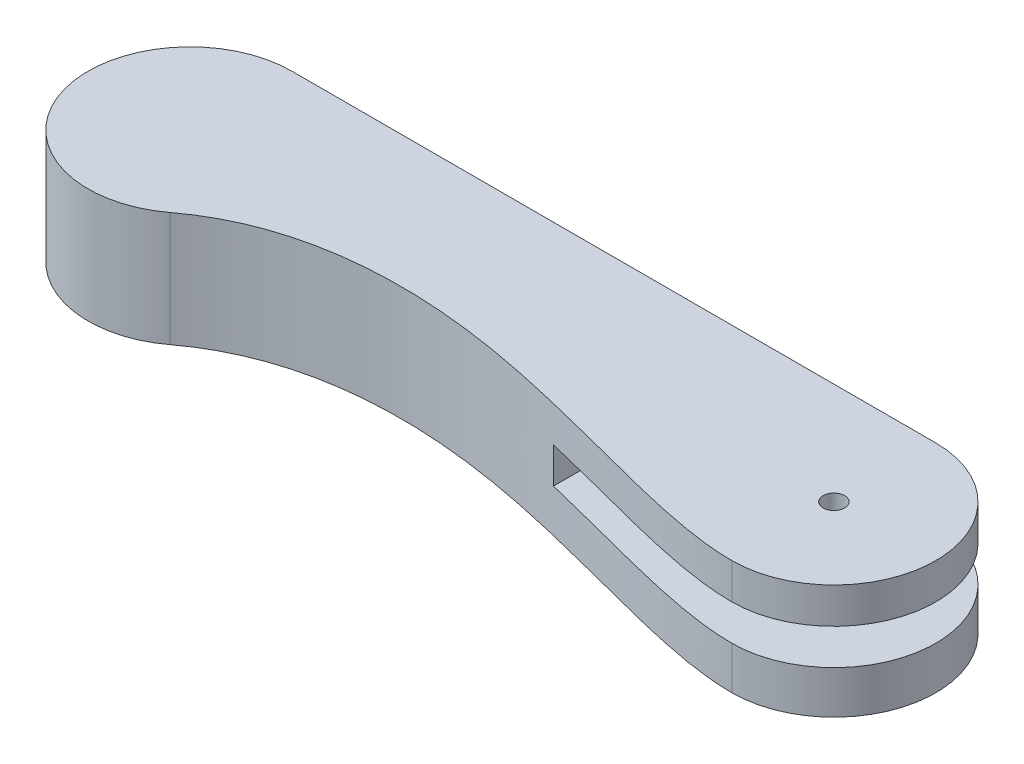
ISO-10303-21;
HEADER;
FILE_DESCRIPTION(('STEP AP214'),'2;1');
FILE_NAME('part.step','',(''),(''),'','','');
FILE_SCHEMA(('AUTOMOTIVE_DESIGN { 1 0 10303 214 1 1 1 1 }'));
ENDSEC;
DATA;
#1=APPLICATION_CONTEXT('core data for automotive mechanical design processes');
#2=APPLICATION_PROTOCOL_DEFINITION('international standard','automotive_design',2000,#1);
#3=PRODUCT_CONTEXT('',#1,'mechanical');
#4=PRODUCT('Part','Part','',(#3));
#5=PRODUCT_RELATED_PRODUCT_CATEGORY('part','',(#4));
#6=PRODUCT_DEFINITION_FORMATION('','',#4);
#7=PRODUCT_DEFINITION_CONTEXT('part definition',#1,'design');
#8=PRODUCT_DEFINITION('design','',#6,#7);
#9=PRODUCT_DEFINITION_SHAPE('','',#8);
#10=(LENGTH_UNIT() NAMED_UNIT(*) SI_UNIT(.MILLI.,.METRE.));
#11=(NAMED_UNIT(*) PLANE_ANGLE_UNIT() SI_UNIT($,.RADIAN.));
#12=(NAMED_UNIT(*) SI_UNIT($,.STERADIAN.) SOLID_ANGLE_UNIT());
#13=UNCERTAINTY_MEASURE_WITH_UNIT(LENGTH_MEASURE(1.E-05),#10,'distance_accuracy_value','');
#14=(GEOMETRIC_REPRESENTATION_CONTEXT(3) GLOBAL_UNCERTAINTY_ASSIGNED_CONTEXT((#13)) GLOBAL_UNIT_ASSIGNED_CONTEXT((#10,
#11,#12)) REPRESENTATION_CONTEXT('',''));
#15=CARTESIAN_POINT('',(0.,0.,0.));
#16=DIRECTION('',(0.,0.,1.));
#17=DIRECTION('',(1.,0.,0.));
#18=AXIS2_PLACEMENT_3D('',#15,#16,#17);
#19=CARTESIAN_POINT('',(-45.,6.,0.));
#20=DIRECTION('',(0.,1.,0.));
#21=DIRECTION('',(0.,0.,1.));
#22=AXIS2_PLACEMENT_3D('',#19,#20,#21);
#23=PLANE('',#22);
#24=CARTESIAN_POINT('',(45.,6.,0.));
#25=DIRECTION('',(0.,-1.,0.));
#26=DIRECTION('',(0.,0.,-1.));
#27=AXIS2_PLACEMENT_3D('',#24,#25,#26);
#28=CIRCLE('',#27,1.5);
#29=CARTESIAN_POINT('',(45.,6.,-1.50000000000002));
#30=VERTEX_POINT('',#29);
#31=EDGE_CURVE('E183',#30,#30,#28,.T.);
#32=ORIENTED_EDGE('',*,*,#31,.T.);
#33=EDGE_LOOP('',(#32));
#34=FACE_BOUND('',#33,.T.);
#35=DIRECTION('',(0.,0.,-1.));
#36=VECTOR('',#35,1.);
#37=CARTESIAN_POINT('',(13.5,6.,-14.25));
#38=LINE('',#37,#36);
#39=CARTESIAN_POINT('',(13.5,6.,7.69593114283536));
#40=VERTEX_POINT('',#39);
#41=CARTESIAN_POINT('',(13.5,6.,-14.25));
#42=VERTEX_POINT('',#41);
#43=EDGE_CURVE('E84',#40,#42,#38,.T.);
#44=ORIENTED_EDGE('',*,*,#43,.F.);
#45=CARTESIAN_POINT('',(-36.4140216624488,6.,11.3729273270826));
#46=CARTESIAN_POINT('',(-26.8003530909368,6.,4.11509935320308));
#47=CARTESIAN_POINT('',(3.01495140687827,6.,1.88775634905101));
#48=CARTESIAN_POINT('',(33.8973569596635,6.,14.25));
#49=CARTESIAN_POINT('',(45.,6.,14.25));
#50=B_SPLINE_CURVE_WITH_KNOTS('',3,(#45,#46,#47,#48,#49),.UNSPECIFIED.,.F.,.F.,(4,1,4),(0.,
0.445881780813994,1.),.UNSPECIFIED.);
#51=CARTESIAN_POINT('',(45.,6.,14.25));
#52=VERTEX_POINT('',#51);
#53=EDGE_CURVE('E204',#52,#40,#50,.F.);
#54=ORIENTED_EDGE('',*,*,#53,.F.);
#55=CARTESIAN_POINT('',(45.,6.,0.));
#56=DIRECTION('',(0.,1.,0.));
#57=DIRECTION('',(0.,0.,1.));
#58=AXIS2_PLACEMENT_3D('',#55,#56,#57);
#59=CIRCLE('',#58,14.25);
#60=CARTESIAN_POINT('',(45.,6.,-14.25));
#61=VERTEX_POINT('',#60);
#62=EDGE_CURVE('E65',#52,#61,#59,.T.);
#63=ORIENTED_EDGE('',*,*,#62,.T.);
#64=DIRECTION('',(-1.,0.,0.));
#65=VECTOR('',#64,1.);
#66=CARTESIAN_POINT('',(-45.,6.,-14.25));
#67=LINE('',#66,#65);
#68=EDGE_CURVE('E146',#61,#42,#67,.T.);
#69=ORIENTED_EDGE('',*,*,#68,.T.);
#70=EDGE_LOOP('',(#44,#54,#63,#69));
#71=FACE_BOUND('',#70,.T.);
#72=ADVANCED_FACE('F39',(#34,#71),#23,.T.);
#73=CARTESIAN_POINT('',(-45.,0.,0.));
#74=DIRECTION('',(0.,1.,0.));
#75=DIRECTION('',(0.,0.,1.));
#76=AXIS2_PLACEMENT_3D('',#73,#74,#75);
#77=PLANE('',#76);
#78=CARTESIAN_POINT('',(-45.,0.,8.25));
#79=DIRECTION('',(0.,1.,0.));
#80=DIRECTION('',(0.,0.,1.));
#81=AXIS2_PLACEMENT_3D('',#78,#79,#80);
#82=CIRCLE('',#81,2.49999999999999);
#83=CARTESIAN_POINT('',(-45.,0.,10.75));
#84=VERTEX_POINT('',#83);
#85=EDGE_CURVE('E186',#84,#84,#82,.F.);
#86=ORIENTED_EDGE('',*,*,#85,.F.);
#87=EDGE_LOOP('',(#86));
#88=FACE_BOUND('',#87,.T.);
#89=CARTESIAN_POINT('',(-44.9999999999999,0.,-8.25));
#90=DIRECTION('',(0.,1.,0.));
#91=DIRECTION('',(0.,0.,1.));
#92=AXIS2_PLACEMENT_3D('',#89,#90,#91);
#93=CIRCLE('',#92,2.49999999999999);
#94=CARTESIAN_POINT('',(-44.9999999999999,0.,-5.75000000000001));
#95=VERTEX_POINT('',#94);
#96=EDGE_CURVE('E139',#95,#95,#93,.F.);
#97=ORIENTED_EDGE('',*,*,#96,.F.);
#98=EDGE_LOOP('',(#97));
#99=FACE_BOUND('',#98,.T.);
#100=CARTESIAN_POINT('',(45.,0.,0.));
#101=DIRECTION('',(0.,-1.,0.));
#102=DIRECTION('',(0.,0.,-1.));
#103=AXIS2_PLACEMENT_3D('',#100,#101,#102);
#104=CIRCLE('',#103,1.5);
#105=CARTESIAN_POINT('',(45.,0.,-1.50000000000002));
#106=VERTEX_POINT('',#105);
#107=EDGE_CURVE('E187',#106,#106,#104,.T.);
#108=ORIENTED_EDGE('',*,*,#107,.F.);
#109=EDGE_LOOP('',(#108));
#110=FACE_BOUND('',#109,.T.);
#111=CARTESIAN_POINT('',(-36.4140216624488,0.,11.3729273270826));
#112=CARTESIAN_POINT('',(-26.8003530909368,0.,4.11509935320308));
#113=CARTESIAN_POINT('',(3.01495140687827,0.,1.88775634905101));
#114=CARTESIAN_POINT('',(33.8973569596635,0.,14.25));
#115=CARTESIAN_POINT('',(45.,0.,14.25));
#116=B_SPLINE_CURVE_WITH_KNOTS('',3,(#111,#112,#113,#114,#115),.UNSPECIFIED.,.F.,.F.,(4,1,4),
(0.,0.445881780813994,1.),.UNSPECIFIED.);
#117=CARTESIAN_POINT('',(45.,0.,14.25));
#118=VERTEX_POINT('',#117);
#119=CARTESIAN_POINT('',(-36.4140216624488,0.,11.3729273270826));
#120=VERTEX_POINT('',#119);
#121=EDGE_CURVE('E124',#118,#120,#116,.F.);
#122=ORIENTED_EDGE('',*,*,#121,.T.);
#123=CARTESIAN_POINT('',(-45.,0.,0.));
#124=DIRECTION('',(0.,1.,0.));
#125=DIRECTION('',(0.,0.,1.));
#126=AXIS2_PLACEMENT_3D('',#123,#124,#125);
#127=CIRCLE('',#126,14.25);
#128=CARTESIAN_POINT('',(-45.,0.,-14.25));
#129=VERTEX_POINT('',#128);
#130=EDGE_CURVE('E136',#129,#120,#127,.T.);
#131=ORIENTED_EDGE('',*,*,#130,.F.);
#132=DIRECTION('',(-1.,0.,0.));
#133=VECTOR('',#132,1.);
#134=CARTESIAN_POINT('',(-45.,0.,-14.25));
#135=LINE('',#134,#133);
#136=CARTESIAN_POINT('',(45.,0.,-14.25));
#137=VERTEX_POINT('',#136);
#138=EDGE_CURVE('E135',#137,#129,#135,.T.);
#139=ORIENTED_EDGE('',*,*,#138,.F.);
#140=CARTESIAN_POINT('',(45.,0.,0.));
#141=DIRECTION('',(0.,1.,0.));
#142=DIRECTION('',(0.,0.,1.));
#143=AXIS2_PLACEMENT_3D('',#140,#141,#142);
#144=CIRCLE('',#143,14.25);
#145=EDGE_CURVE('E76',#118,#137,#144,.T.);
#146=ORIENTED_EDGE('',*,*,#145,.F.);
#147=EDGE_LOOP('',(#122,#131,#139,#146));
#148=FACE_BOUND('',#147,.T.);
#149=ADVANCED_FACE('F134',(#88,#99,#110,#148),#77,.F.);
#150=CARTESIAN_POINT('',(13.5,11.,-14.25));
#151=DIRECTION('',(-1.,0.,0.));
#152=DIRECTION('',(0.,0.,1.));
#153=AXIS2_PLACEMENT_3D('',#150,#151,#152);
#154=PLANE('',#153);
#155=DIRECTION('',(0.,1.,0.));
#156=VECTOR('',#155,1.);
#157=CARTESIAN_POINT('',(13.5,-0.001000000000001,7.69593114283536));
#158=LINE('',#157,#156);
#159=CARTESIAN_POINT('',(13.5000000009841,11.,7.69593114307158));
#160=VERTEX_POINT('',#159);
#161=EDGE_CURVE('E203',#160,#40,#158,.F.);
#162=ORIENTED_EDGE('',*,*,#161,.T.);
#163=ORIENTED_EDGE('',*,*,#43,.T.);
#164=DIRECTION('',(0.,-1.,0.));
#165=VECTOR('',#164,1.);
#166=CARTESIAN_POINT('',(13.5,11.,-14.25));
#167=LINE('',#166,#165);
#168=CARTESIAN_POINT('',(13.5,11.,-14.25));
#169=VERTEX_POINT('',#168);
#170=EDGE_CURVE('E178',#169,#42,#167,.T.);
#171=ORIENTED_EDGE('',*,*,#170,.F.);
#172=DIRECTION('',(0.,0.,-1.));
#173=VECTOR('',#172,1.);
#174=CARTESIAN_POINT('',(13.5,11.,-14.25));
#175=LINE('',#174,#173);
#176=EDGE_CURVE('E91',#160,#169,#175,.T.);
#177=ORIENTED_EDGE('',*,*,#176,.F.);
#178=EDGE_LOOP('',(#162,#163,#171,#177));
#179=FACE_BOUND('',#178,.T.);
#180=ADVANCED_FACE('F202',(#179),#154,.F.);
#181=CARTESIAN_POINT('',(-45.,11.,0.));
#182=DIRECTION('',(0.,1.,0.));
#183=DIRECTION('',(0.,0.,1.));
#184=AXIS2_PLACEMENT_3D('',#181,#182,#183);
#185=PLANE('',#184);
#186=CARTESIAN_POINT('',(45.,11.,0.));
#187=DIRECTION('',(0.,1.,0.));
#188=DIRECTION('',(0.,0.,1.));
#189=AXIS2_PLACEMENT_3D('',#186,#187,#188);
#190=CIRCLE('',#189,1.5);
#191=CARTESIAN_POINT('',(45.,11.,1.49999999999999));
#192=VERTEX_POINT('',#191);
#193=EDGE_CURVE('E155',#192,#192,#190,.F.);
#194=ORIENTED_EDGE('',*,*,#193,.F.);
#195=EDGE_LOOP('',(#194));
#196=FACE_BOUND('',#195,.T.);
#197=CARTESIAN_POINT('',(-36.4140216624488,11.,11.3729273270826));
#198=CARTESIAN_POINT('',(-26.8003530909368,11.,4.11509935320308));
#199=CARTESIAN_POINT('',(3.01495140687827,11.,1.88775634905101));
#200=CARTESIAN_POINT('',(33.8973569596635,11.,14.25));
#201=CARTESIAN_POINT('',(45.,11.,14.25));
#202=B_SPLINE_CURVE_WITH_KNOTS('',3,(#197,#198,#199,#200,#201),.UNSPECIFIED.,.F.,.F.,(4,1,4),
(0.,0.445881780813994,1.),.UNSPECIFIED.);
#203=CARTESIAN_POINT('',(45.,11.,14.25));
#204=VERTEX_POINT('',#203);
#205=EDGE_CURVE('E130',#204,#160,#202,.F.);
#206=ORIENTED_EDGE('',*,*,#205,.T.);
#207=ORIENTED_EDGE('',*,*,#176,.T.);
#208=DIRECTION('',(-1.,0.,0.));
#209=VECTOR('',#208,1.);
#210=CARTESIAN_POINT('',(-45.,11.,-14.25));
#211=LINE('',#210,#209);
#212=CARTESIAN_POINT('',(45.,11.,-14.25));
#213=VERTEX_POINT('',#212);
#214=EDGE_CURVE('E154',#213,#169,#211,.T.);
#215=ORIENTED_EDGE('',*,*,#214,.F.);
#216=CARTESIAN_POINT('',(45.,11.,0.));
#217=DIRECTION('',(0.,1.,0.));
#218=DIRECTION('',(0.,0.,1.));
#219=AXIS2_PLACEMENT_3D('',#216,#217,#218);
#220=CIRCLE('',#219,14.25);
#221=EDGE_CURVE('E153',#204,#213,#220,.T.);
#222=ORIENTED_EDGE('',*,*,#221,.F.);
#223=EDGE_LOOP('',(#206,#207,#215,#222));
#224=FACE_BOUND('',#223,.T.);
#225=ADVANCED_FACE('F239',(#196,#224),#185,.F.);
#226=CARTESIAN_POINT('',(-45.,16.,0.));
#227=DIRECTION('',(0.,1.,0.));
#228=DIRECTION('',(0.,0.,1.));
#229=AXIS2_PLACEMENT_3D('',#226,#227,#228);
#230=PLANE('',#229);
#231=CARTESIAN_POINT('',(45.,16.,0.));
#232=DIRECTION('',(0.,1.,0.));
#233=DIRECTION('',(0.,0.,1.));
#234=AXIS2_PLACEMENT_3D('',#231,#232,#233);
#235=CIRCLE('',#234,1.5);
#236=CARTESIAN_POINT('',(45.,16.,1.49999999999999));
#237=VERTEX_POINT('',#236);
#238=EDGE_CURVE('E163',#237,#237,#235,.T.);
#239=ORIENTED_EDGE('',*,*,#238,.F.);
#240=EDGE_LOOP('',(#239));
#241=FACE_BOUND('',#240,.T.);
#242=CARTESIAN_POINT('',(-45.,16.,0.));
#243=DIRECTION('',(0.,1.,0.));
#244=DIRECTION('',(0.,0.,1.));
#245=AXIS2_PLACEMENT_3D('',#242,#243,#244);
#246=CIRCLE('',#245,14.25);
#247=CARTESIAN_POINT('',(-45.,16.,-14.25));
#248=VERTEX_POINT('',#247);
#249=CARTESIAN_POINT('',(-36.4140216624488,16.,11.3729273270826));
#250=VERTEX_POINT('',#249);
#251=EDGE_CURVE('E56',#248,#250,#246,.T.);
#252=ORIENTED_EDGE('',*,*,#251,.T.);
#253=CARTESIAN_POINT('',(-36.4140216624488,16.,11.3729273270826));
#254=CARTESIAN_POINT('',(-26.8003530909368,16.,4.11509935320308));
#255=CARTESIAN_POINT('',(3.01495140687827,16.,1.88775634905101));
#256=CARTESIAN_POINT('',(33.8973569596635,16.,14.25));
#257=CARTESIAN_POINT('',(45.,16.,14.25));
#258=B_SPLINE_CURVE_WITH_KNOTS('',3,(#253,#254,#255,#256,#257),.UNSPECIFIED.,.F.,.F.,(4,1,4),
(0.,0.445881780813994,1.),.UNSPECIFIED.);
#259=CARTESIAN_POINT('',(45.,16.,14.25));
#260=VERTEX_POINT('',#259);
#261=EDGE_CURVE('E206',#250,#260,#258,.T.);
#262=ORIENTED_EDGE('',*,*,#261,.T.);
#263=CARTESIAN_POINT('',(45.,16.,0.));
#264=DIRECTION('',(0.,1.,0.));
#265=DIRECTION('',(0.,0.,1.));
#266=AXIS2_PLACEMENT_3D('',#263,#264,#265);
#267=CIRCLE('',#266,14.25);
#268=CARTESIAN_POINT('',(45.,16.,-14.25));
#269=VERTEX_POINT('',#268);
#270=EDGE_CURVE('E172',#260,#269,#267,.T.);
#271=ORIENTED_EDGE('',*,*,#270,.T.);
#272=DIRECTION('',(-1.,0.,0.));
#273=VECTOR('',#272,1.);
#274=CARTESIAN_POINT('',(-45.,16.,-14.25));
#275=LINE('',#274,#273);
#276=EDGE_CURVE('E174',#269,#248,#275,.T.);
#277=ORIENTED_EDGE('',*,*,#276,.T.);
#278=EDGE_LOOP('',(#252,#262,#271,#277));
#279=FACE_BOUND('',#278,.T.);
#280=ADVANCED_FACE('F236',(#241,#279),#230,.T.);
#281=CARTESIAN_POINT('',(-45.,6.,0.));
#282=DIRECTION('',(0.,-1.,0.));
#283=DIRECTION('',(0.,0.,-1.));
#284=AXIS2_PLACEMENT_3D('',#281,#282,#283);
#285=CYLINDRICAL_SURFACE('',#284,14.25);
#286=ORIENTED_EDGE('',*,*,#130,.T.);
#287=DIRECTION('',(0.,1.,0.));
#288=VECTOR('',#287,1.);
#289=CARTESIAN_POINT('',(-36.4140216624488,-0.001000000000001,11.3729273270826));
#290=LINE('',#289,#288);
#291=EDGE_CURVE('E127',#120,#250,#290,.T.);
#292=ORIENTED_EDGE('',*,*,#291,.T.);
#293=ORIENTED_EDGE('',*,*,#251,.F.);
#294=DIRECTION('',(0.,-1.,0.));
#295=VECTOR('',#294,1.);
#296=CARTESIAN_POINT('',(-45.,6.,-14.25));
#297=LINE('',#296,#295);
#298=EDGE_CURVE('E143',#248,#129,#297,.T.);
#299=ORIENTED_EDGE('',*,*,#298,.T.);
#300=EDGE_LOOP('',(#286,#292,#293,#299));
#301=FACE_BOUND('',#300,.T.);
#302=ADVANCED_FACE('F41',(#301),#285,.T.);
#303=CARTESIAN_POINT('',(45.,6.,0.));
#304=DIRECTION('',(0.,-1.,0.));
#305=DIRECTION('',(0.,0.,-1.));
#306=AXIS2_PLACEMENT_3D('',#303,#304,#305);
#307=CYLINDRICAL_SURFACE('',#306,14.25);
#308=ORIENTED_EDGE('',*,*,#145,.T.);
#309=DIRECTION('',(0.,-1.,0.));
#310=VECTOR('',#309,1.);
#311=CARTESIAN_POINT('',(45.,6.,-14.25));
#312=LINE('',#311,#310);
#313=EDGE_CURVE('E48',#61,#137,#312,.T.);
#314=ORIENTED_EDGE('',*,*,#313,.F.);
#315=ORIENTED_EDGE('',*,*,#62,.F.);
#316=DIRECTION('',(0.,-1.,0.));
#317=VECTOR('',#316,1.);
#318=CARTESIAN_POINT('',(45.,6.,14.25));
#319=LINE('',#318,#317);
#320=EDGE_CURVE('E11',#52,#118,#319,.T.);
#321=ORIENTED_EDGE('',*,*,#320,.T.);
#322=EDGE_LOOP('',(#308,#314,#315,#321));
#323=FACE_BOUND('',#322,.T.);
#324=ADVANCED_FACE('F132',(#323),#307,.T.);
#325=CARTESIAN_POINT('',(-45.,6.,-14.25));
#326=DIRECTION('',(0.,0.,1.));
#327=DIRECTION('',(1.,0.,0.));
#328=AXIS2_PLACEMENT_3D('',#325,#326,#327);
#329=PLANE('',#328);
#330=ORIENTED_EDGE('',*,*,#138,.T.);
#331=ORIENTED_EDGE('',*,*,#298,.F.);
#332=ORIENTED_EDGE('',*,*,#276,.F.);
#333=DIRECTION('',(0.,-1.,0.));
#334=VECTOR('',#333,1.);
#335=CARTESIAN_POINT('',(45.,16.,-14.25));
#336=LINE('',#335,#334);
#337=EDGE_CURVE('E151',#269,#213,#336,.T.);
#338=ORIENTED_EDGE('',*,*,#337,.T.);
#339=ORIENTED_EDGE('',*,*,#214,.T.);
#340=ORIENTED_EDGE('',*,*,#170,.T.);
#341=ORIENTED_EDGE('',*,*,#68,.F.);
#342=ORIENTED_EDGE('',*,*,#313,.T.);
#343=EDGE_LOOP('',(#330,#331,#332,#338,#339,#340,#341,#342));
#344=FACE_BOUND('',#343,.T.);
#345=ADVANCED_FACE('F201',(#344),#329,.F.);
#346=CARTESIAN_POINT('',(-45.,-0.00100000000000013,8.25));
#347=DIRECTION('',(0.,1.,0.));
#348=DIRECTION('',(0.,0.,1.));
#349=AXIS2_PLACEMENT_3D('',#346,#347,#348);
#350=CYLINDRICAL_SURFACE('',#349,2.49999999999999);
#351=CARTESIAN_POINT('',(-45.,6.,8.25));
#352=DIRECTION('',(0.,1.,0.));
#353=DIRECTION('',(0.,0.,1.));
#354=AXIS2_PLACEMENT_3D('',#351,#352,#353);
#355=CIRCLE('',#354,2.49999999999999);
#356=CARTESIAN_POINT('',(-45.,6.,10.75));
#357=VERTEX_POINT('',#356);
#358=EDGE_CURVE('E182',#357,#357,#355,.T.);
#359=CARTESIAN_POINT('',(-45.,6.,10.75));
#360=CARTESIAN_POINT('',(-45.,5.9375,10.75));
#361=CARTESIAN_POINT('',(-45.,5.875,10.75));
#362=CARTESIAN_POINT('',(-45.,5.75,10.75));
#363=CARTESIAN_POINT('',(-45.,5.6875,10.75));
#364=CARTESIAN_POINT('',(-45.,5.5625,10.75));
#365=CARTESIAN_POINT('',(-45.,5.5,10.75));
#366=CARTESIAN_POINT('',(-45.,5.375,10.75));
#367=CARTESIAN_POINT('',(-45.,5.3125,10.75));
#368=CARTESIAN_POINT('',(-45.,5.1875,10.75));
#369=CARTESIAN_POINT('',(-45.,5.125,10.75));
#370=CARTESIAN_POINT('',(-45.,5.,10.75));
#371=CARTESIAN_POINT('',(-45.,4.9375,10.75));
#372=CARTESIAN_POINT('',(-45.,4.8125,10.75));
#373=CARTESIAN_POINT('',(-45.,4.75,10.75));
#374=CARTESIAN_POINT('',(-45.,4.625,10.75));
#375=CARTESIAN_POINT('',(-45.,4.5625,10.75));
#376=CARTESIAN_POINT('',(-45.,4.4375,10.75));
#377=CARTESIAN_POINT('',(-45.,4.375,10.75));
#378=CARTESIAN_POINT('',(-45.,4.25,10.75));
#379=CARTESIAN_POINT('',(-45.,4.1875,10.75));
#380=CARTESIAN_POINT('',(-45.,4.0625,10.75));
#381=CARTESIAN_POINT('',(-45.,4.,10.75));
#382=CARTESIAN_POINT('',(-45.,3.875,10.75));
#383=CARTESIAN_POINT('',(-45.,3.8125,10.75));
#384=CARTESIAN_POINT('',(-45.,3.6875,10.75));
#385=CARTESIAN_POINT('',(-45.,3.625,10.75));
#386=CARTESIAN_POINT('',(-45.,3.5,10.75));
#387=CARTESIAN_POINT('',(-45.,3.4375,10.75));
#388=CARTESIAN_POINT('',(-45.,3.3125,10.75));
#389=CARTESIAN_POINT('',(-45.,3.25,10.75));
#390=CARTESIAN_POINT('',(-45.,3.125,10.75));
#391=CARTESIAN_POINT('',(-45.,3.0625,10.75));
#392=CARTESIAN_POINT('',(-45.,2.9375,10.75));
#393=CARTESIAN_POINT('',(-45.,2.875,10.75));
#394=CARTESIAN_POINT('',(-45.,2.75,10.75));
#395=CARTESIAN_POINT('',(-45.,2.6875,10.75));
#396=CARTESIAN_POINT('',(-45.,2.5625,10.75));
#397=CARTESIAN_POINT('',(-45.,2.5,10.75));
#398=CARTESIAN_POINT('',(-45.,2.375,10.75));
#399=CARTESIAN_POINT('',(-45.,2.3125,10.75));
#400=CARTESIAN_POINT('',(-45.,2.1875,10.75));
#401=CARTESIAN_POINT('',(-45.,2.125,10.75));
#402=CARTESIAN_POINT('',(-45.,2.,10.75));
#403=CARTESIAN_POINT('',(-45.,1.9375,10.75));
#404=CARTESIAN_POINT('',(-45.,1.8125,10.75));
#405=CARTESIAN_POINT('',(-45.,1.75,10.75));
#406=CARTESIAN_POINT('',(-45.,1.625,10.75));
#407=CARTESIAN_POINT('',(-45.,1.5625,10.75));
#408=CARTESIAN_POINT('',(-45.,1.4375,10.75));
#409=CARTESIAN_POINT('',(-45.,1.375,10.75));
#410=CARTESIAN_POINT('',(-45.,1.25,10.75));
#411=CARTESIAN_POINT('',(-45.,1.1875,10.75));
#412=CARTESIAN_POINT('',(-45.,1.0625,10.75));
#413=CARTESIAN_POINT('',(-45.,1.,10.75));
#414=CARTESIAN_POINT('',(-45.,0.875,10.75));
#415=CARTESIAN_POINT('',(-45.,0.8125,10.75));
#416=CARTESIAN_POINT('',(-45.,0.6875,10.75));
#417=CARTESIAN_POINT('',(-45.,0.625,10.75));
#418=CARTESIAN_POINT('',(-45.,0.5,10.75));
#419=CARTESIAN_POINT('',(-45.,0.4375,10.75));
#420=CARTESIAN_POINT('',(-45.,0.3125,10.75));
#421=CARTESIAN_POINT('',(-45.,0.25,10.75));
#422=CARTESIAN_POINT('',(-45.,0.125,10.75));
#423=CARTESIAN_POINT('',(-45.,0.0625000000000001,10.75));
#424=CARTESIAN_POINT('',(-45.,0.,10.75));
#425=B_SPLINE_CURVE_WITH_KNOTS('',3,(#359,#360,#361,#362,#363,#364,#365,#366,#367,#368,#369,
#370,#371,#372,#373,#374,#375,#376,#377,#378,#379,#380,#381,#382,#383,#384,#385,#386,#387,#388,
#389,#390,#391,#392,#393,#394,#395,#396,#397,#398,#399,#400,#401,#402,#403,#404,#405,#406,#407,
#408,#409,#410,#411,#412,#413,#414,#415,#416,#417,#418,#419,#420,#421,#422,#423,#424),
.UNSPECIFIED.,.F.,.F.,(4,2,2,2,2,2,2,2,2,2,2,2,2,2,2,2,2,2,2,2,2,2,2,2,2,2,2,2,2,2,2,2,4),(0.,
0.1875,0.375,0.5625,0.75,0.9375,1.125,1.3125,1.5,1.6875,1.875,2.0625,2.25,2.4375,2.625,2.8125,
3.,3.1875,3.375,3.5625,3.75,3.9375,4.125,4.3125,4.5,4.6875,4.875,5.0625,5.25,5.4375,5.625,
5.8125,6.),.UNSPECIFIED.);
#426=EDGE_CURVE('BSEAM260',#357,#84,#425,.T.);
#427=ORIENTED_EDGE('',*,*,#358,.T.);
#428=ORIENTED_EDGE('',*,*,#85,.T.);
#429=ORIENTED_EDGE('',*,*,#426,.T.);
#430=ORIENTED_EDGE('',*,*,#426,.F.);
#431=EDGE_LOOP('',(#427,#429,#428,#430));
#432=FACE_BOUND('',#431,.T.);
#433=ADVANCED_FACE('F260',(#432),#350,.F.);
#434=CARTESIAN_POINT('',(-44.9999999999999,-0.00100000000000013,-8.25));
#435=DIRECTION('',(0.,1.,0.));
#436=DIRECTION('',(0.,0.,1.));
#437=AXIS2_PLACEMENT_3D('',#434,#435,#436);
#438=CYLINDRICAL_SURFACE('',#437,2.49999999999999);
#439=CARTESIAN_POINT('',(-44.9999999999999,6.,-8.25));
#440=DIRECTION('',(0.,1.,0.));
#441=DIRECTION('',(0.,0.,1.));
#442=AXIS2_PLACEMENT_3D('',#439,#440,#441);
#443=CIRCLE('',#442,2.49999999999999);
#444=CARTESIAN_POINT('',(-44.9999999999999,6.,-5.75000000000001));
#445=VERTEX_POINT('',#444);
#446=EDGE_CURVE('E190',#445,#445,#443,.T.);
#447=CARTESIAN_POINT('',(-44.9999999999999,6.,-5.75000000000001));
#448=CARTESIAN_POINT('',(-44.9999999999999,5.9375,-5.75000000000001));
#449=CARTESIAN_POINT('',(-44.9999999999999,5.875,-5.75000000000001));
#450=CARTESIAN_POINT('',(-44.9999999999999,5.75,-5.75000000000001));
#451=CARTESIAN_POINT('',(-44.9999999999999,5.6875,-5.75000000000001));
#452=CARTESIAN_POINT('',(-44.9999999999999,5.5625,-5.75000000000001));
#453=CARTESIAN_POINT('',(-44.9999999999999,5.5,-5.75000000000001));
#454=CARTESIAN_POINT('',(-44.9999999999999,5.375,-5.75000000000001));
#455=CARTESIAN_POINT('',(-44.9999999999999,5.3125,-5.75000000000001));
#456=CARTESIAN_POINT('',(-44.9999999999999,5.1875,-5.75000000000001));
#457=CARTESIAN_POINT('',(-44.9999999999999,5.125,-5.75000000000001));
#458=CARTESIAN_POINT('',(-44.9999999999999,5.,-5.75000000000001));
#459=CARTESIAN_POINT('',(-44.9999999999999,4.9375,-5.75000000000001));
#460=CARTESIAN_POINT('',(-44.9999999999999,4.8125,-5.75000000000001));
#461=CARTESIAN_POINT('',(-44.9999999999999,4.75,-5.75000000000001));
#462=CARTESIAN_POINT('',(-44.9999999999999,4.625,-5.75000000000001));
#463=CARTESIAN_POINT('',(-44.9999999999999,4.5625,-5.75000000000001));
#464=CARTESIAN_POINT('',(-44.9999999999999,4.4375,-5.75000000000001));
#465=CARTESIAN_POINT('',(-44.9999999999999,4.375,-5.75000000000001));
#466=CARTESIAN_POINT('',(-44.9999999999999,4.25,-5.75000000000001));
#467=CARTESIAN_POINT('',(-44.9999999999999,4.1875,-5.75000000000001));
#468=CARTESIAN_POINT('',(-44.9999999999999,4.0625,-5.75000000000001));
#469=CARTESIAN_POINT('',(-44.9999999999999,4.,-5.75000000000001));
#470=CARTESIAN_POINT('',(-44.9999999999999,3.875,-5.75000000000001));
#471=CARTESIAN_POINT('',(-44.9999999999999,3.8125,-5.75000000000001));
#472=CARTESIAN_POINT('',(-44.9999999999999,3.6875,-5.75000000000001));
#473=CARTESIAN_POINT('',(-44.9999999999999,3.625,-5.75000000000001));
#474=CARTESIAN_POINT('',(-44.9999999999999,3.5,-5.75000000000001));
#475=CARTESIAN_POINT('',(-44.9999999999999,3.4375,-5.75000000000001));
#476=CARTESIAN_POINT('',(-44.9999999999999,3.3125,-5.75000000000001));
#477=CARTESIAN_POINT('',(-44.9999999999999,3.25,-5.75000000000001));
#478=CARTESIAN_POINT('',(-44.9999999999999,3.125,-5.75000000000001));
#479=CARTESIAN_POINT('',(-44.9999999999999,3.0625,-5.75000000000001));
#480=CARTESIAN_POINT('',(-44.9999999999999,2.9375,-5.75000000000001));
#481=CARTESIAN_POINT('',(-44.9999999999999,2.875,-5.75000000000001));
#482=CARTESIAN_POINT('',(-44.9999999999999,2.75,-5.75000000000001));
#483=CARTESIAN_POINT('',(-44.9999999999999,2.6875,-5.75000000000001));
#484=CARTESIAN_POINT('',(-44.9999999999999,2.5625,-5.75000000000001));
#485=CARTESIAN_POINT('',(-44.9999999999999,2.5,-5.75000000000001));
#486=CARTESIAN_POINT('',(-44.9999999999999,2.375,-5.75000000000001));
#487=CARTESIAN_POINT('',(-44.9999999999999,2.3125,-5.75000000000001));
#488=CARTESIAN_POINT('',(-44.9999999999999,2.1875,-5.75000000000001));
#489=CARTESIAN_POINT('',(-44.9999999999999,2.125,-5.75000000000001));
#490=CARTESIAN_POINT('',(-44.9999999999999,2.,-5.75000000000001));
#491=CARTESIAN_POINT('',(-44.9999999999999,1.9375,-5.75000000000001));
#492=CARTESIAN_POINT('',(-44.9999999999999,1.8125,-5.75000000000001));
#493=CARTESIAN_POINT('',(-44.9999999999999,1.75,-5.75000000000001));
#494=CARTESIAN_POINT('',(-44.9999999999999,1.625,-5.75000000000001));
#495=CARTESIAN_POINT('',(-44.9999999999999,1.5625,-5.75000000000001));
#496=CARTESIAN_POINT('',(-44.9999999999999,1.4375,-5.75000000000001));
#497=CARTESIAN_POINT('',(-44.9999999999999,1.375,-5.75000000000001));
#498=CARTESIAN_POINT('',(-44.9999999999999,1.25,-5.75000000000001));
#499=CARTESIAN_POINT('',(-44.9999999999999,1.1875,-5.75000000000001));
#500=CARTESIAN_POINT('',(-44.9999999999999,1.0625,-5.75000000000001));
#501=CARTESIAN_POINT('',(-44.9999999999999,1.,-5.75000000000001));
#502=CARTESIAN_POINT('',(-44.9999999999999,0.875,-5.75000000000001));
#503=CARTESIAN_POINT('',(-44.9999999999999,0.8125,-5.75000000000001));
#504=CARTESIAN_POINT('',(-44.9999999999999,0.6875,-5.75000000000001));
#505=CARTESIAN_POINT('',(-44.9999999999999,0.625,-5.75000000000001));
#506=CARTESIAN_POINT('',(-44.9999999999999,0.5,-5.75000000000001));
#507=CARTESIAN_POINT('',(-44.9999999999999,0.4375,-5.75000000000001));
#508=CARTESIAN_POINT('',(-44.9999999999999,0.3125,-5.75000000000001));
#509=CARTESIAN_POINT('',(-44.9999999999999,0.25,-5.75000000000001));
#510=CARTESIAN_POINT('',(-44.9999999999999,0.125,-5.75000000000001));
#511=CARTESIAN_POINT('',(-44.9999999999999,0.0625000000000001,-5.75000000000001));
#512=CARTESIAN_POINT('',(-44.9999999999999,0.,-5.75000000000001));
#513=B_SPLINE_CURVE_WITH_KNOTS('',3,(#447,#448,#449,#450,#451,#452,#453,#454,#455,#456,#457,
#458,#459,#460,#461,#462,#463,#464,#465,#466,#467,#468,#469,#470,#471,#472,#473,#474,#475,#476,
#477,#478,#479,#480,#481,#482,#483,#484,#485,#486,#487,#488,#489,#490,#491,#492,#493,#494,#495,
#496,#497,#498,#499,#500,#501,#502,#503,#504,#505,#506,#507,#508,#509,#510,#511,#512),
.UNSPECIFIED.,.F.,.F.,(4,2,2,2,2,2,2,2,2,2,2,2,2,2,2,2,2,2,2,2,2,2,2,2,2,2,2,2,2,2,2,2,4),(0.,
0.1875,0.375,0.5625,0.75,0.9375,1.125,1.3125,1.5,1.6875,1.875,2.0625,2.25,2.4375,2.625,2.8125,
3.,3.1875,3.375,3.5625,3.75,3.9375,4.125,4.3125,4.5,4.6875,4.875,5.0625,5.25,5.4375,5.625,
5.8125,6.),.UNSPECIFIED.);
#514=EDGE_CURVE('BSEAM256',#445,#95,#513,.T.);
#515=ORIENTED_EDGE('',*,*,#446,.T.);
#516=ORIENTED_EDGE('',*,*,#96,.T.);
#517=ORIENTED_EDGE('',*,*,#514,.T.);
#518=ORIENTED_EDGE('',*,*,#514,.F.);
#519=EDGE_LOOP('',(#515,#517,#516,#518));
#520=FACE_BOUND('',#519,.T.);
#521=ADVANCED_FACE('F256',(#520),#438,.F.);
#522=CARTESIAN_POINT('',(45.,6.,0.));
#523=DIRECTION('',(0.,-1.,0.));
#524=DIRECTION('',(0.,0.,-1.));
#525=AXIS2_PLACEMENT_3D('',#522,#523,#524);
#526=CYLINDRICAL_SURFACE('',#525,1.5);
#527=ORIENTED_EDGE('',*,*,#31,.F.);
#528=EDGE_LOOP('',(#527));
#529=FACE_BOUND('',#528,.T.);
#530=ORIENTED_EDGE('',*,*,#107,.T.);
#531=EDGE_LOOP('',(#530));
#532=FACE_BOUND('',#531,.T.);
#533=ADVANCED_FACE('F250',(#529,#532),#526,.F.);
#534=CARTESIAN_POINT('',(-45.,6.,0.));
#535=DIRECTION('',(0.,1.,0.));
#536=DIRECTION('',(0.,0.,1.));
#537=AXIS2_PLACEMENT_3D('',#534,#535,#536);
#538=PLANE('',#537);
#539=ORIENTED_EDGE('',*,*,#358,.F.);
#540=EDGE_LOOP('',(#539));
#541=FACE_BOUND('',#540,.T.);
#542=ADVANCED_FACE('F247',(#541),#538,.F.);
#543=ORIENTED_EDGE('',*,*,#446,.F.);
#544=EDGE_LOOP('',(#543));
#545=FACE_BOUND('',#544,.T.);
#546=ADVANCED_FACE('F246',(#545),#538,.F.);
#547=CARTESIAN_POINT('',(45.,16.,0.));
#548=DIRECTION('',(0.,-1.,0.));
#549=DIRECTION('',(0.,0.,-1.));
#550=AXIS2_PLACEMENT_3D('',#547,#548,#549);
#551=CYLINDRICAL_SURFACE('',#550,14.25);
#552=ORIENTED_EDGE('',*,*,#221,.T.);
#553=ORIENTED_EDGE('',*,*,#337,.F.);
#554=ORIENTED_EDGE('',*,*,#270,.F.);
#555=DIRECTION('',(0.,-1.,0.));
#556=VECTOR('',#555,1.);
#557=CARTESIAN_POINT('',(45.,16.,14.25));
#558=LINE('',#557,#556);
#559=EDGE_CURVE('E148',#260,#204,#558,.T.);
#560=ORIENTED_EDGE('',*,*,#559,.T.);
#561=EDGE_LOOP('',(#552,#553,#554,#560));
#562=FACE_BOUND('',#561,.T.);
#563=ADVANCED_FACE('F234',(#562),#551,.T.);
#564=CARTESIAN_POINT('',(45.,-0.001000000000001,0.));
#565=DIRECTION('',(0.,1.,0.));
#566=DIRECTION('',(0.,0.,1.));
#567=AXIS2_PLACEMENT_3D('',#564,#565,#566);
#568=CYLINDRICAL_SURFACE('',#567,1.5);
#569=ORIENTED_EDGE('',*,*,#238,.T.);
#570=EDGE_LOOP('',(#569));
#571=FACE_BOUND('',#570,.T.);
#572=ORIENTED_EDGE('',*,*,#193,.T.);
#573=EDGE_LOOP('',(#572));
#574=FACE_BOUND('',#573,.T.);
#575=ADVANCED_FACE('F231',(#571,#574),#568,.F.);
#576=CARTESIAN_POINT('',(-36.4140216624488,-0.001000000000001,11.3729273270826));
#577=CARTESIAN_POINT('',(-26.8003530909368,-0.001000000000001,4.11509935320308));
#578=CARTESIAN_POINT('',(3.01495140687827,-0.001000000000001,1.88775634905101));
#579=CARTESIAN_POINT('',(33.8973569596635,-0.001000000000001,14.25));
#580=CARTESIAN_POINT('',(45.,-0.001000000000001,14.25));
#581=B_SPLINE_CURVE_WITH_KNOTS('',3,(#576,#577,#578,#579,#580),.UNSPECIFIED.,.F.,.F.,(4,1,4),
(0.,0.445881780813994,1.),.UNSPECIFIED.);
#582=DIRECTION('',(0.,1.,0.));
#583=VECTOR('',#582,1.);
#584=SURFACE_OF_LINEAR_EXTRUSION('',#581,#583);
#585=ORIENTED_EDGE('',*,*,#320,.F.);
#586=ORIENTED_EDGE('',*,*,#53,.T.);
#587=ORIENTED_EDGE('',*,*,#161,.F.);
#588=ORIENTED_EDGE('',*,*,#205,.F.);
#589=ORIENTED_EDGE('',*,*,#559,.F.);
#590=ORIENTED_EDGE('',*,*,#261,.F.);
#591=ORIENTED_EDGE('',*,*,#291,.F.);
#592=ORIENTED_EDGE('',*,*,#121,.F.);
#593=EDGE_LOOP('',(#585,#586,#587,#588,#589,#590,#591,#592));
#594=FACE_BOUND('',#593,.T.);
#595=ADVANCED_FACE('F125',(#594),#584,.T.);
#596=CLOSED_SHELL('',(#72,#149,#180,#225,#280,#302,#324,#345,#433,#521,#533,#542,#546,#563,#575,#595));
#597=MANIFOLD_SOLID_BREP('B2',#596);
#598=ADVANCED_BREP_SHAPE_REPRESENTATION('',(#18,#597),#14);
#599=SHAPE_DEFINITION_REPRESENTATION(#9,#598);
ENDSEC;
END-ISO-10303-21;
